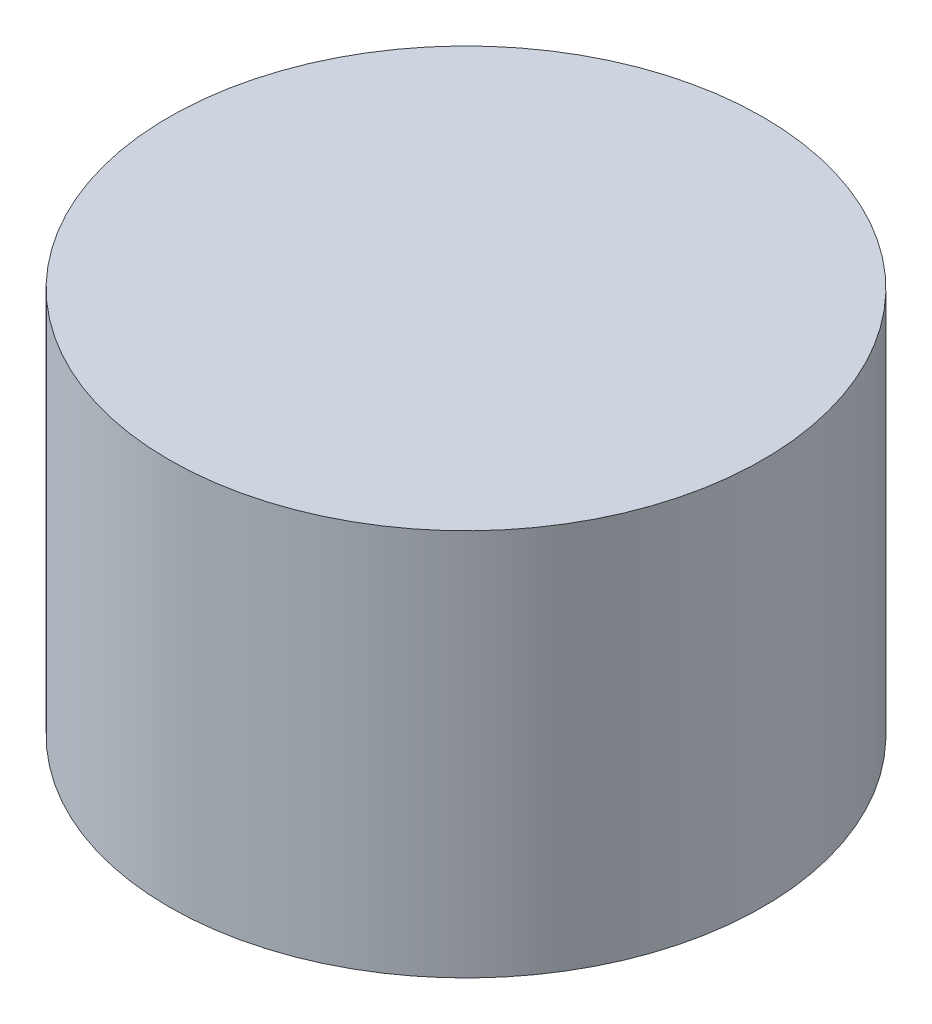
ISO-10303-21;
HEADER;
FILE_DESCRIPTION(('STEP AP214'),'2;1');
FILE_NAME('part.step','',(''),(''),'','','');
FILE_SCHEMA(('AUTOMOTIVE_DESIGN { 1 0 10303 214 1 1 1 1 }'));
ENDSEC;
DATA;
#1=APPLICATION_CONTEXT('core data for automotive mechanical design processes');
#2=APPLICATION_PROTOCOL_DEFINITION('international standard','automotive_design',2000,#1);
#3=PRODUCT_CONTEXT('',#1,'mechanical');
#4=PRODUCT('Part','Part','',(#3));
#5=PRODUCT_RELATED_PRODUCT_CATEGORY('part','',(#4));
#6=PRODUCT_DEFINITION_FORMATION('','',#4);
#7=PRODUCT_DEFINITION_CONTEXT('part definition',#1,'design');
#8=PRODUCT_DEFINITION('design','',#6,#7);
#9=PRODUCT_DEFINITION_SHAPE('','',#8);
#10=(LENGTH_UNIT() NAMED_UNIT(*) SI_UNIT(.MILLI.,.METRE.));
#11=(NAMED_UNIT(*) PLANE_ANGLE_UNIT() SI_UNIT($,.RADIAN.));
#12=(NAMED_UNIT(*) SI_UNIT($,.STERADIAN.) SOLID_ANGLE_UNIT());
#13=UNCERTAINTY_MEASURE_WITH_UNIT(LENGTH_MEASURE(1.E-05),#10,'distance_accuracy_value','');
#14=(GEOMETRIC_REPRESENTATION_CONTEXT(3) GLOBAL_UNCERTAINTY_ASSIGNED_CONTEXT((#13)) GLOBAL_UNIT_ASSIGNED_CONTEXT((#10,
#11,#12)) REPRESENTATION_CONTEXT('',''));
#15=CARTESIAN_POINT('',(0.,0.,0.));
#16=DIRECTION('',(0.,0.,1.));
#17=DIRECTION('',(1.,0.,0.));
#18=AXIS2_PLACEMENT_3D('',#15,#16,#17);
#19=CARTESIAN_POINT('',(0.,-15.,0.));
#20=DIRECTION('',(0.,1.,0.));
#21=DIRECTION('',(0.,0.,1.));
#22=AXIS2_PLACEMENT_3D('',#19,#20,#21);
#23=CYLINDRICAL_SURFACE('',#22,11.5);
#24=CARTESIAN_POINT('',(0.,-15.,0.));
#25=DIRECTION('',(0.,1.,0.));
#26=DIRECTION('',(0.,0.,1.));
#27=AXIS2_PLACEMENT_3D('',#24,#25,#26);
#28=CIRCLE('',#27,11.5);
#29=CARTESIAN_POINT('',(0.,-15.,11.5));
#30=VERTEX_POINT('',#29);
#31=EDGE_CURVE('E10',#30,#30,#28,.T.);
#32=ORIENTED_EDGE('',*,*,#31,.T.);
#33=EDGE_LOOP('',(#32));
#34=FACE_BOUND('',#33,.T.);
#35=CARTESIAN_POINT('',(0.,0.,0.));
#36=DIRECTION('',(0.,1.,0.));
#37=DIRECTION('',(0.,0.,1.));
#38=AXIS2_PLACEMENT_3D('',#35,#36,#37);
#39=CIRCLE('',#38,11.5);
#40=CARTESIAN_POINT('',(0.,0.,11.5));
#41=VERTEX_POINT('',#40);
#42=EDGE_CURVE('E41',#41,#41,#39,.T.);
#43=ORIENTED_EDGE('',*,*,#42,.F.);
#44=EDGE_LOOP('',(#43));
#45=FACE_BOUND('',#44,.T.);
#46=ADVANCED_FACE('F34',(#34,#45),#23,.T.);
#47=CARTESIAN_POINT('',(0.,-15.,0.));
#48=DIRECTION('',(0.,1.,0.));
#49=DIRECTION('',(0.,0.,1.));
#50=AXIS2_PLACEMENT_3D('',#47,#48,#49);
#51=PLANE('',#50);
#52=CARTESIAN_POINT('',(0.,-15.,0.));
#53=DIRECTION('',(0.,1.,0.));
#54=DIRECTION('',(0.,0.,1.));
#55=AXIS2_PLACEMENT_3D('',#52,#53,#54);
#56=CIRCLE('',#55,8.83176086632785);
#57=CARTESIAN_POINT('',(0.,-15.,8.83176086632785));
#58=VERTEX_POINT('',#57);
#59=EDGE_CURVE('E37',#58,#58,#56,.T.);
#60=ORIENTED_EDGE('',*,*,#59,.T.);
#61=EDGE_LOOP('',(#60));
#62=FACE_BOUND('',#61,.T.);
#63=ORIENTED_EDGE('',*,*,#31,.F.);
#64=EDGE_LOOP('',(#63));
#65=FACE_BOUND('',#64,.T.);
#66=ADVANCED_FACE('F51',(#62,#65),#51,.F.);
#67=CARTESIAN_POINT('',(0.,0.,0.));
#68=DIRECTION('',(0.,1.,0.));
#69=DIRECTION('',(0.,0.,1.));
#70=AXIS2_PLACEMENT_3D('',#67,#68,#69);
#71=PLANE('',#70);
#72=ORIENTED_EDGE('',*,*,#42,.T.);
#73=EDGE_LOOP('',(#72));
#74=FACE_BOUND('',#73,.T.);
#75=ADVANCED_FACE('F56',(#74),#71,.T.);
#76=CARTESIAN_POINT('',(0.,-11.5,0.));
#77=DIRECTION('',(0.,1.,0.));
#78=DIRECTION('',(1.,0.,0.));
#79=AXIS2_PLACEMENT_3D('',#76,#77,#78);
#80=SPHERICAL_SURFACE('',#79,9.5);
#81=ORIENTED_EDGE('',*,*,#59,.F.);
#82=EDGE_LOOP('',(#81));
#83=FACE_BOUND('',#82,.T.);
#84=ADVANCED_FACE('F54',(#83),#80,.T.);
#85=CLOSED_SHELL('',(#46,#66,#75,#84));
#86=MANIFOLD_SOLID_BREP('B2',#85);
#87=ADVANCED_BREP_SHAPE_REPRESENTATION('',(#18,#86),#14);
#88=SHAPE_DEFINITION_REPRESENTATION(#9,#87);
ENDSEC;
END-ISO-10303-21;
